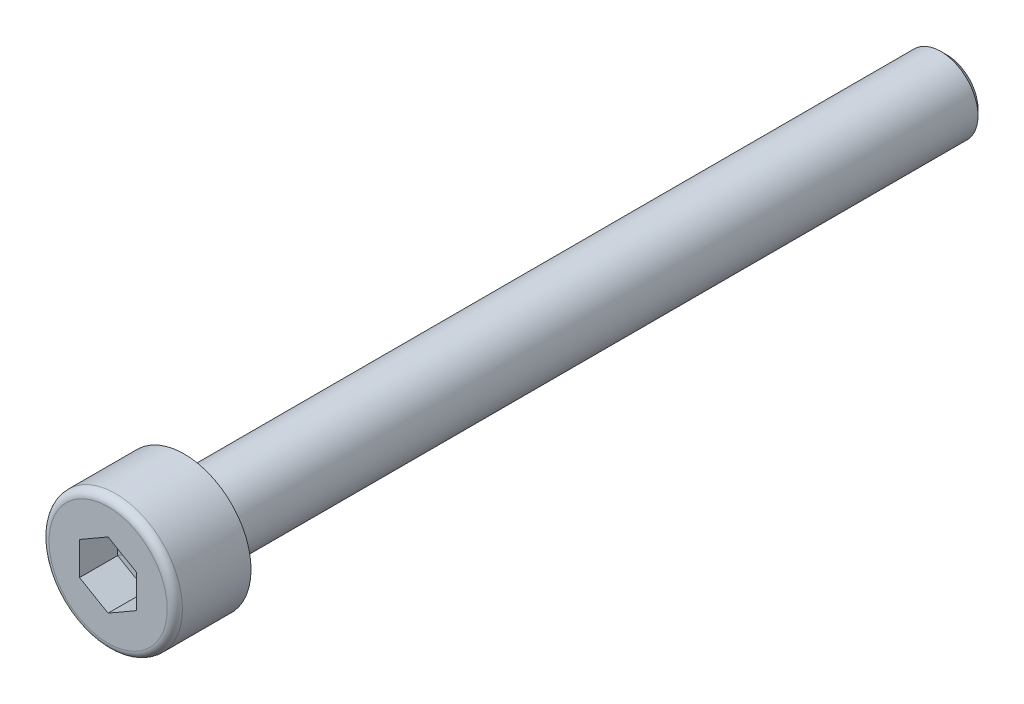
ISO-10303-21;
HEADER;
FILE_DESCRIPTION(('STEP AP214'),'2;1');
FILE_NAME('part.step','',(''),(''),'','','');
FILE_SCHEMA(('AUTOMOTIVE_DESIGN { 1 0 10303 214 1 1 1 1 }'));
ENDSEC;
DATA;
#1=APPLICATION_CONTEXT('core data for automotive mechanical design processes');
#2=APPLICATION_PROTOCOL_DEFINITION('international standard','automotive_design',2000,#1);
#3=PRODUCT_CONTEXT('',#1,'mechanical');
#4=PRODUCT('Part','Part','',(#3));
#5=PRODUCT_RELATED_PRODUCT_CATEGORY('part','',(#4));
#6=PRODUCT_DEFINITION_FORMATION('','',#4);
#7=PRODUCT_DEFINITION_CONTEXT('part definition',#1,'design');
#8=PRODUCT_DEFINITION('design','',#6,#7);
#9=PRODUCT_DEFINITION_SHAPE('','',#8);
#10=(LENGTH_UNIT() NAMED_UNIT(*) SI_UNIT(.MILLI.,.METRE.));
#11=(NAMED_UNIT(*) PLANE_ANGLE_UNIT() SI_UNIT($,.RADIAN.));
#12=(NAMED_UNIT(*) SI_UNIT($,.STERADIAN.) SOLID_ANGLE_UNIT());
#13=UNCERTAINTY_MEASURE_WITH_UNIT(LENGTH_MEASURE(1.E-05),#10,'distance_accuracy_value','');
#14=(GEOMETRIC_REPRESENTATION_CONTEXT(3) GLOBAL_UNCERTAINTY_ASSIGNED_CONTEXT((#13)) GLOBAL_UNIT_ASSIGNED_CONTEXT((#10,
#11,#12)) REPRESENTATION_CONTEXT('',''));
#15=CARTESIAN_POINT('',(0.,0.,0.));
#16=DIRECTION('',(0.,0.,1.));
#17=DIRECTION('',(1.,0.,0.));
#18=AXIS2_PLACEMENT_3D('',#15,#16,#17);
#19=CARTESIAN_POINT('',(-1.99999999999971,0.,-5.5228302982796E-13));
#20=DIRECTION('',(0.,0.,-1.));
#21=DIRECTION('',(0.,-1.,0.));
#22=AXIS2_PLACEMENT_3D('',#19,#20,#21);
#23=PLANE('',#22);
#24=CARTESIAN_POINT('',(0.,0.,-5.46229728115577E-13));
#25=DIRECTION('',(0.,0.,-1.));
#26=DIRECTION('',(-1.,0.,0.));
#27=AXIS2_PLACEMENT_3D('',#24,#25,#26);
#28=CIRCLE('',#27,1.954);
#29=CARTESIAN_POINT('',(1.954,0.,-5.39684409837686E-13));
#30=VERTEX_POINT('',#29);
#31=EDGE_CURVE('E11',#30,#30,#28,.T.);
#32=ORIENTED_EDGE('',*,*,#31,.F.);
#33=EDGE_LOOP('',(#32));
#34=FACE_BOUND('',#33,.T.);
#35=CARTESIAN_POINT('',(0.,0.,-9.56064350066868E-13));
#36=DIRECTION('',(0.,0.,-1.));
#37=DIRECTION('',(1.,0.,0.));
#38=AXIS2_PLACEMENT_3D('',#35,#36,#37);
#39=CIRCLE('',#38,3.49999999999972);
#40=CARTESIAN_POINT('',(3.49999999999971,0.,-9.45354905468321E-13));
#41=VERTEX_POINT('',#40);
#42=EDGE_CURVE('E195',#41,#41,#39,.T.);
#43=ORIENTED_EDGE('',*,*,#42,.T.);
#44=EDGE_LOOP('',(#43));
#45=FACE_BOUND('',#44,.T.);
#46=ADVANCED_FACE('F17',(#34,#45),#23,.T.);
#47=CARTESIAN_POINT('',(1.0769163338864E-13,0.,-40.));
#48=DIRECTION('',(0.,0.,-1.));
#49=DIRECTION('',(0.,-1.,0.));
#50=AXIS2_PLACEMENT_3D('',#47,#48,#49);
#51=PLANE('',#50);
#52=CARTESIAN_POINT('',(0.,0.,-40.));
#53=DIRECTION('',(0.,0.,-1.));
#54=DIRECTION('',(-1.,0.,0.));
#55=AXIS2_PLACEMENT_3D('',#52,#53,#54);
#56=CIRCLE('',#55,1.63999999997624);
#57=CARTESIAN_POINT('',(1.63999999997624,0.,-40.));
#58=VERTEX_POINT('',#57);
#59=EDGE_CURVE('E124',#58,#58,#56,.T.);
#60=ORIENTED_EDGE('',*,*,#59,.T.);
#61=EDGE_LOOP('',(#60));
#62=FACE_BOUND('',#61,.T.);
#63=ADVANCED_FACE('F500',(#62),#51,.T.);
#64=CARTESIAN_POINT('',(0.,0.,-20.0000000000003));
#65=DIRECTION('',(0.,0.,-1.));
#66=DIRECTION('',(-1.,0.,0.));
#67=AXIS2_PLACEMENT_3D('',#64,#65,#66);
#68=CYLINDRICAL_SURFACE('',#67,1.954);
#69=CARTESIAN_POINT('',(1.06776702927888E-13,0.,-39.6859999999766));
#70=DIRECTION('',(0.,0.,1.));
#71=DIRECTION('',(-1.,0.,0.));
#72=AXIS2_PLACEMENT_3D('',#69,#70,#71);
#73=CIRCLE('',#72,1.954);
#74=CARTESIAN_POINT('',(1.95400000000011,0.,-39.6859999999766));
#75=VERTEX_POINT('',#74);
#76=EDGE_CURVE('E117',#75,#75,#73,.T.);
#77=ORIENTED_EDGE('',*,*,#76,.T.);
#78=DIRECTION('',(0.,0.,1.));
#79=VECTOR('',#78,1.);
#80=CARTESIAN_POINT('',(1.95400000000005,0.,-20.0000000000003));
#81=LINE('',#80,#79);
#82=EDGE_CURVE('E20',#75,#30,#81,.T.);
#83=ORIENTED_EDGE('',*,*,#82,.T.);
#84=ORIENTED_EDGE('',*,*,#31,.T.);
#85=ORIENTED_EDGE('',*,*,#82,.F.);
#86=EDGE_LOOP('',(#77,#83,#84,#85));
#87=FACE_BOUND('',#86,.T.);
#88=ADVANCED_FACE('F115',(#87),#68,.T.);
#89=CARTESIAN_POINT('',(-1.5,0.866025403784454,4.));
#90=DIRECTION('',(-0.5,0.866025403784438,0.));
#91=DIRECTION('',(0.,0.,1.));
#92=AXIS2_PLACEMENT_3D('',#89,#90,#91);
#93=PLANE('',#92);
#94=DIRECTION('',(0.866025403784438,0.5,0.));
#95=VECTOR('',#94,1.);
#96=CARTESIAN_POINT('',(-2.4374999999999,0.324759526419233,3.99999999999474));
#97=LINE('',#96,#95);
#98=CARTESIAN_POINT('',(-1.5,0.866025403784454,4.));
#99=VERTEX_POINT('',#98);
#100=CARTESIAN_POINT('',(0.,1.73205080756889,4.));
#101=VERTEX_POINT('',#100);
#102=EDGE_CURVE('E137',#99,#101,#97,.T.);
#103=ORIENTED_EDGE('',*,*,#102,.F.);
#104=DIRECTION('',(0.,0.,-1.));
#105=VECTOR('',#104,1.);
#106=CARTESIAN_POINT('',(-1.5,0.866025403784454,4.));
#107=LINE('',#106,#105);
#108=CARTESIAN_POINT('',(-1.5,0.866025403784454,2.));
#109=VERTEX_POINT('',#108);
#110=EDGE_CURVE('E139',#99,#109,#107,.T.);
#111=ORIENTED_EDGE('',*,*,#110,.T.);
#112=DIRECTION('',(0.866025403784438,0.5,0.));
#113=VECTOR('',#112,1.);
#114=CARTESIAN_POINT('',(0.,1.73205080756889,2.));
#115=LINE('',#114,#113);
#116=CARTESIAN_POINT('',(0.,1.73205080756889,2.));
#117=VERTEX_POINT('',#116);
#118=EDGE_CURVE('E219',#109,#117,#115,.T.);
#119=ORIENTED_EDGE('',*,*,#118,.T.);
#120=DIRECTION('',(0.,0.,-1.));
#121=VECTOR('',#120,1.);
#122=CARTESIAN_POINT('',(0.,1.73205080756889,4.));
#123=LINE('',#122,#121);
#124=EDGE_CURVE('E45',#101,#117,#123,.T.);
#125=ORIENTED_EDGE('',*,*,#124,.F.);
#126=EDGE_LOOP('',(#103,#111,#119,#125));
#127=FACE_BOUND('',#126,.T.);
#128=ADVANCED_FACE('F483',(#127),#93,.F.);
#129=CARTESIAN_POINT('',(0.,1.73205080756889,4.));
#130=DIRECTION('',(0.5,0.866025403784438,0.));
#131=DIRECTION('',(0.,0.,-1.));
#132=AXIS2_PLACEMENT_3D('',#129,#130,#131);
#133=PLANE('',#132);
#134=DIRECTION('',(0.866025403784438,-0.5,0.));
#135=VECTOR('',#134,1.);
#136=CARTESIAN_POINT('',(-0.937499999999895,2.27331668493411,3.99999999999474));
#137=LINE('',#136,#135);
#138=CARTESIAN_POINT('',(1.5,0.866025403784452,4.));
#139=VERTEX_POINT('',#138);
#140=EDGE_CURVE('E173',#101,#139,#137,.T.);
#141=ORIENTED_EDGE('',*,*,#140,.F.);
#142=ORIENTED_EDGE('',*,*,#124,.T.);
#143=DIRECTION('',(0.866025403784438,-0.5,0.));
#144=VECTOR('',#143,1.);
#145=CARTESIAN_POINT('',(1.5,0.866025403784452,2.));
#146=LINE('',#145,#144);
#147=CARTESIAN_POINT('',(1.5,0.866025403784452,2.));
#148=VERTEX_POINT('',#147);
#149=EDGE_CURVE('E215',#117,#148,#146,.T.);
#150=ORIENTED_EDGE('',*,*,#149,.T.);
#151=DIRECTION('',(0.,0.,-1.));
#152=VECTOR('',#151,1.);
#153=CARTESIAN_POINT('',(1.5,0.866025403784452,4.));
#154=LINE('',#153,#152);
#155=EDGE_CURVE('E229',#139,#148,#154,.T.);
#156=ORIENTED_EDGE('',*,*,#155,.F.);
#157=EDGE_LOOP('',(#141,#142,#150,#156));
#158=FACE_BOUND('',#157,.T.);
#159=ADVANCED_FACE('F474',(#158),#133,.F.);
#160=CARTESIAN_POINT('',(1.5,0.866025403784452,4.));
#161=DIRECTION('',(1.,0.,0.));
#162=DIRECTION('',(0.,-1.,0.));
#163=AXIS2_PLACEMENT_3D('',#160,#161,#162);
#164=PLANE('',#163);
#165=DIRECTION('',(0.,-1.,0.));
#166=VECTOR('',#165,1.);
#167=CARTESIAN_POINT('',(1.5,0.433012701892219,3.99999999999475));
#168=LINE('',#167,#166);
#169=CARTESIAN_POINT('',(1.5,-0.866025403784423,4.));
#170=VERTEX_POINT('',#169);
#171=EDGE_CURVE('E177',#139,#170,#168,.T.);
#172=ORIENTED_EDGE('',*,*,#171,.F.);
#173=ORIENTED_EDGE('',*,*,#155,.T.);
#174=DIRECTION('',(0.,-1.,0.));
#175=VECTOR('',#174,1.);
#176=CARTESIAN_POINT('',(1.5,-0.866025403784423,2.));
#177=LINE('',#176,#175);
#178=CARTESIAN_POINT('',(1.5,-0.866025403784423,2.));
#179=VERTEX_POINT('',#178);
#180=EDGE_CURVE('E182',#148,#179,#177,.T.);
#181=ORIENTED_EDGE('',*,*,#180,.T.);
#182=DIRECTION('',(0.,0.,-1.));
#183=VECTOR('',#182,1.);
#184=CARTESIAN_POINT('',(1.5,-0.866025403784423,4.));
#185=LINE('',#184,#183);
#186=EDGE_CURVE('E226',#170,#179,#185,.T.);
#187=ORIENTED_EDGE('',*,*,#186,.F.);
#188=EDGE_LOOP('',(#172,#173,#181,#187));
#189=FACE_BOUND('',#188,.T.);
#190=ADVANCED_FACE('F465',(#189),#164,.F.);
#191=CARTESIAN_POINT('',(1.5,-0.866025403784423,4.));
#192=DIRECTION('',(0.5,-0.866025403784438,0.));
#193=DIRECTION('',(0.,0.,-1.));
#194=AXIS2_PLACEMENT_3D('',#191,#192,#193);
#195=PLANE('',#194);
#196=DIRECTION('',(-0.866025403784438,-0.5,0.));
#197=VECTOR('',#196,1.);
#198=CARTESIAN_POINT('',(-0.187499999999902,-1.84030398304186,3.99999999999475));
#199=LINE('',#198,#197);
#200=CARTESIAN_POINT('',(0.,-1.73205080756886,4.));
#201=VERTEX_POINT('',#200);
#202=EDGE_CURVE('E190',#170,#201,#199,.T.);
#203=ORIENTED_EDGE('',*,*,#202,.F.);
#204=ORIENTED_EDGE('',*,*,#186,.T.);
#205=DIRECTION('',(-0.866025403784438,-0.5,0.));
#206=VECTOR('',#205,1.);
#207=CARTESIAN_POINT('',(0.,-1.73205080756886,2.));
#208=LINE('',#207,#206);
#209=CARTESIAN_POINT('',(0.,-1.73205080756886,2.));
#210=VERTEX_POINT('',#209);
#211=EDGE_CURVE('E154',#179,#210,#208,.T.);
#212=ORIENTED_EDGE('',*,*,#211,.T.);
#213=DIRECTION('',(0.,0.,-1.));
#214=VECTOR('',#213,1.);
#215=CARTESIAN_POINT('',(0.,-1.73205080756886,4.));
#216=LINE('',#215,#214);
#217=EDGE_CURVE('E142',#201,#210,#216,.T.);
#218=ORIENTED_EDGE('',*,*,#217,.F.);
#219=EDGE_LOOP('',(#203,#204,#212,#218));
#220=FACE_BOUND('',#219,.T.);
#221=ADVANCED_FACE('F455',(#220),#195,.F.);
#222=CARTESIAN_POINT('',(0.,-1.73205080756886,4.));
#223=DIRECTION('',(-0.5,-0.866025403784438,0.));
#224=DIRECTION('',(-0.866025403784438,0.5,0.));
#225=AXIS2_PLACEMENT_3D('',#222,#223,#224);
#226=PLANE('',#225);
#227=DIRECTION('',(-0.866025403784438,0.5,0.));
#228=VECTOR('',#227,1.);
#229=CARTESIAN_POINT('',(-1.6874999999999,-0.757772228311425,3.99999999999474));
#230=LINE('',#229,#228);
#231=CARTESIAN_POINT('',(-1.5,-0.866025403784421,4.));
#232=VERTEX_POINT('',#231);
#233=EDGE_CURVE('E191',#201,#232,#230,.T.);
#234=ORIENTED_EDGE('',*,*,#233,.F.);
#235=ORIENTED_EDGE('',*,*,#217,.T.);
#236=DIRECTION('',(-0.866025403784438,0.5,0.));
#237=VECTOR('',#236,1.);
#238=CARTESIAN_POINT('',(-1.5,-0.866025403784421,2.));
#239=LINE('',#238,#237);
#240=CARTESIAN_POINT('',(-1.5,-0.866025403784421,2.));
#241=VERTEX_POINT('',#240);
#242=EDGE_CURVE('E155',#210,#241,#239,.T.);
#243=ORIENTED_EDGE('',*,*,#242,.T.);
#244=DIRECTION('',(0.,0.,-1.));
#245=VECTOR('',#244,1.);
#246=CARTESIAN_POINT('',(-1.5,-0.866025403784421,4.));
#247=LINE('',#246,#245);
#248=EDGE_CURVE('E143',#232,#241,#247,.T.);
#249=ORIENTED_EDGE('',*,*,#248,.F.);
#250=EDGE_LOOP('',(#234,#235,#243,#249));
#251=FACE_BOUND('',#250,.T.);
#252=ADVANCED_FACE('F446',(#251),#226,.F.);
#253=CARTESIAN_POINT('',(-1.5,-0.866025403784421,4.));
#254=DIRECTION('',(-1.,0.,0.));
#255=DIRECTION('',(0.,0.,1.));
#256=AXIS2_PLACEMENT_3D('',#253,#254,#255);
#257=PLANE('',#256);
#258=DIRECTION('',(0.,1.,0.));
#259=VECTOR('',#258,1.);
#260=CARTESIAN_POINT('',(-1.5,-0.43301270189221,3.99999999999474));
#261=LINE('',#260,#259);
#262=EDGE_CURVE('E156',#232,#99,#261,.T.);
#263=ORIENTED_EDGE('',*,*,#262,.F.);
#264=ORIENTED_EDGE('',*,*,#248,.T.);
#265=DIRECTION('',(0.,1.,0.));
#266=VECTOR('',#265,1.);
#267=CARTESIAN_POINT('',(-1.5,0.866025403784454,2.));
#268=LINE('',#267,#266);
#269=EDGE_CURVE('E144',#241,#109,#268,.T.);
#270=ORIENTED_EDGE('',*,*,#269,.T.);
#271=ORIENTED_EDGE('',*,*,#110,.F.);
#272=EDGE_LOOP('',(#263,#264,#270,#271));
#273=FACE_BOUND('',#272,.T.);
#274=ADVANCED_FACE('F435',(#273),#257,.F.);
#275=CARTESIAN_POINT('',(0.,1.73205080756889,2.));
#276=DIRECTION('',(-0.0435778713738291,0.0754790873051732,-0.996194698091746));
#277=DIRECTION('',(-0.999044587684655,0.,0.0437025378896691));
#278=AXIS2_PLACEMENT_3D('',#275,#276,#277);
#279=PLANE('',#278);
#280=DIRECTION('',(0.,-0.997141949694317,-0.0755508581011306));
#281=VECTOR('',#280,1.);
#282=CARTESIAN_POINT('',(0.,1.30150971280341,1.96737901843634));
#283=LINE('',#282,#281);
#284=CARTESIAN_POINT('',(0.,0.,1.86876700471111));
#285=VERTEX_POINT('',#284);
#286=EDGE_CURVE('E216',#117,#285,#283,.T.);
#287=ORIENTED_EDGE('',*,*,#286,.F.);
#288=ORIENTED_EDGE('',*,*,#118,.F.);
#289=DIRECTION('',(0.863550259614423,-0.498570974847158,-0.0755508581011305));
#290=VECTOR('',#289,1.);
#291=CARTESIAN_POINT('',(-1.12714047455993,0.650754856401714,1.96737901843634));
#292=LINE('',#291,#290);
#293=EDGE_CURVE('E149',#109,#285,#292,.T.);
#294=ORIENTED_EDGE('',*,*,#293,.T.);
#295=EDGE_LOOP('',(#287,#288,#294));
#296=FACE_BOUND('',#295,.T.);
#297=ADVANCED_FACE('F425',(#296),#279,.F.);
#298=CARTESIAN_POINT('',(1.5,0.866025403784452,2.));
#299=DIRECTION('',(0.0435778713738292,0.0754790873051732,-0.996194698091746));
#300=DIRECTION('',(-0.999044587684655,0.,-0.0437025378896692));
#301=AXIS2_PLACEMENT_3D('',#298,#299,#300);
#302=PLANE('',#301);
#303=DIRECTION('',(-0.863550259614424,-0.498570974847157,-0.0755508581011305));
#304=VECTOR('',#303,1.);
#305=CARTESIAN_POINT('',(1.12714047455993,0.650754856401714,1.96737901843634));
#306=LINE('',#305,#304);
#307=EDGE_CURVE('E211',#148,#285,#306,.T.);
#308=ORIENTED_EDGE('',*,*,#307,.F.);
#309=ORIENTED_EDGE('',*,*,#149,.F.);
#310=ORIENTED_EDGE('',*,*,#286,.T.);
#311=EDGE_LOOP('',(#308,#309,#310));
#312=FACE_BOUND('',#311,.T.);
#313=ADVANCED_FACE('F415',(#312),#302,.F.);
#314=CARTESIAN_POINT('',(1.5,-0.866025403784423,2.));
#315=DIRECTION('',(0.0871557427476581,0.,-0.996194698091746));
#316=DIRECTION('',(0.,-1.,0.));
#317=AXIS2_PLACEMENT_3D('',#314,#315,#316);
#318=PLANE('',#317);
#319=DIRECTION('',(-0.863550259614423,0.498570974847159,-0.0755508581011306));
#320=VECTOR('',#319,1.);
#321=CARTESIAN_POINT('',(1.12714047455993,-0.650754856401685,1.96737901843634));
#322=LINE('',#321,#320);
#323=EDGE_CURVE('E178',#179,#285,#322,.T.);
#324=ORIENTED_EDGE('',*,*,#323,.F.);
#325=ORIENTED_EDGE('',*,*,#180,.F.);
#326=ORIENTED_EDGE('',*,*,#307,.T.);
#327=EDGE_LOOP('',(#324,#325,#326));
#328=FACE_BOUND('',#327,.T.);
#329=ADVANCED_FACE('F405',(#328),#318,.F.);
#330=CARTESIAN_POINT('',(0.,-1.73205080756886,2.));
#331=DIRECTION('',(0.0435778713738292,-0.0754790873051732,-0.996194698091746));
#332=DIRECTION('',(0.,-0.997141949694317,0.0755508581011304));
#333=AXIS2_PLACEMENT_3D('',#330,#331,#332);
#334=PLANE('',#333);
#335=DIRECTION('',(0.,0.997141949694317,-0.0755508581011304));
#336=VECTOR('',#335,1.);
#337=CARTESIAN_POINT('',(0.,-1.30150971280338,1.96737901843634));
#338=LINE('',#337,#336);
#339=EDGE_CURVE('E150',#210,#285,#338,.T.);
#340=ORIENTED_EDGE('',*,*,#339,.F.);
#341=ORIENTED_EDGE('',*,*,#211,.F.);
#342=ORIENTED_EDGE('',*,*,#323,.T.);
#343=EDGE_LOOP('',(#340,#341,#342));
#344=FACE_BOUND('',#343,.T.);
#345=ADVANCED_FACE('F395',(#344),#334,.F.);
#346=CARTESIAN_POINT('',(-1.5,-0.866025403784421,2.));
#347=DIRECTION('',(-0.0435778713738292,-0.0754790873051732,-0.996194698091746));
#348=DIRECTION('',(0.,-0.997141949694317,0.0755508581011304));
#349=AXIS2_PLACEMENT_3D('',#346,#347,#348);
#350=PLANE('',#349);
#351=DIRECTION('',(0.863550259614423,0.498570974847157,-0.0755508581011306));
#352=VECTOR('',#351,1.);
#353=CARTESIAN_POINT('',(-1.12714047455993,-0.650754856401681,1.96737901843634));
#354=LINE('',#353,#352);
#355=EDGE_CURVE('E148',#241,#285,#354,.T.);
#356=ORIENTED_EDGE('',*,*,#355,.F.);
#357=ORIENTED_EDGE('',*,*,#242,.F.);
#358=ORIENTED_EDGE('',*,*,#339,.T.);
#359=EDGE_LOOP('',(#356,#357,#358));
#360=FACE_BOUND('',#359,.T.);
#361=ADVANCED_FACE('F385',(#360),#350,.F.);
#362=CARTESIAN_POINT('',(-1.5,0.866025403784454,2.));
#363=DIRECTION('',(-0.0871557427476581,0.,-0.996194698091746));
#364=DIRECTION('',(-0.996194698091746,0.,0.0871557427476581));
#365=AXIS2_PLACEMENT_3D('',#362,#363,#364);
#366=PLANE('',#365);
#367=ORIENTED_EDGE('',*,*,#293,.F.);
#368=ORIENTED_EDGE('',*,*,#269,.F.);
#369=ORIENTED_EDGE('',*,*,#355,.T.);
#370=EDGE_LOOP('',(#367,#368,#369));
#371=FACE_BOUND('',#370,.T.);
#372=ADVANCED_FACE('F374',(#371),#366,.F.);
#373=CARTESIAN_POINT('',(0.,0.,1.9999999999969));
#374=DIRECTION('',(0.,0.,-1.));
#375=DIRECTION('',(-1.,0.,0.));
#376=AXIS2_PLACEMENT_3D('',#373,#374,#375);
#377=CYLINDRICAL_SURFACE('',#376,3.49999999999972);
#378=ORIENTED_EDGE('',*,*,#42,.F.);
#379=DIRECTION('',(0.,0.,1.));
#380=VECTOR('',#379,1.);
#381=CARTESIAN_POINT('',(3.4999999999997,0.,1.99999999999691));
#382=LINE('',#381,#380);
#383=CARTESIAN_POINT('',(3.49999999999969,0.,3.59999999999476));
#384=VERTEX_POINT('',#383);
#385=EDGE_CURVE('E186',#41,#384,#382,.T.);
#386=ORIENTED_EDGE('',*,*,#385,.T.);
#387=CARTESIAN_POINT('',(0.,0.,3.59999999999475));
#388=DIRECTION('',(0.,0.,1.));
#389=DIRECTION('',(1.,0.,0.));
#390=AXIS2_PLACEMENT_3D('',#387,#388,#389);
#391=CIRCLE('',#390,3.49999999999972);
#392=EDGE_CURVE('E132',#384,#384,#391,.T.);
#393=ORIENTED_EDGE('',*,*,#392,.F.);
#394=ORIENTED_EDGE('',*,*,#385,.F.);
#395=EDGE_LOOP('',(#378,#386,#393,#394));
#396=FACE_BOUND('',#395,.T.);
#397=ADVANCED_FACE('F363',(#396),#377,.T.);
#398=CARTESIAN_POINT('',(-3.49999999999974,0.,3.99999999999474));
#399=DIRECTION('',(0.,0.,1.));
#400=DIRECTION('',(1.,0.,0.));
#401=AXIS2_PLACEMENT_3D('',#398,#399,#400);
#402=PLANE('',#401);
#403=ORIENTED_EDGE('',*,*,#262,.T.);
#404=ORIENTED_EDGE('',*,*,#102,.T.);
#405=ORIENTED_EDGE('',*,*,#140,.T.);
#406=ORIENTED_EDGE('',*,*,#171,.T.);
#407=ORIENTED_EDGE('',*,*,#202,.T.);
#408=ORIENTED_EDGE('',*,*,#233,.T.);
#409=EDGE_LOOP('',(#403,#404,#405,#406,#407,#408));
#410=FACE_BOUND('',#409,.T.);
#411=CARTESIAN_POINT('',(0.,0.,3.99999999999475));
#412=DIRECTION('',(0.,0.,-1.));
#413=DIRECTION('',(1.,0.,0.));
#414=AXIS2_PLACEMENT_3D('',#411,#412,#413);
#415=CIRCLE('',#414,3.09999999999972);
#416=CARTESIAN_POINT('',(3.09999999999969,0.,3.99999999999476));
#417=VERTEX_POINT('',#416);
#418=EDGE_CURVE('E159',#417,#417,#415,.T.);
#419=ORIENTED_EDGE('',*,*,#418,.F.);
#420=EDGE_LOOP('',(#419));
#421=FACE_BOUND('',#420,.T.);
#422=ADVANCED_FACE('F353',(#410,#421),#402,.T.);
#423=CARTESIAN_POINT('',(0.,0.,3.59999999999475));
#424=DIRECTION('',(0.,0.,-1.));
#425=DIRECTION('',(-1.,0.,0.));
#426=AXIS2_PLACEMENT_3D('',#423,#424,#425);
#427=TOROIDAL_SURFACE('',#426,3.09999999999972,0.4);
#428=ORIENTED_EDGE('',*,*,#392,.T.);
#429=CARTESIAN_POINT('',(3.09999999999969,0.,3.59999999999476));
#430=DIRECTION('',(0.,-1.,0.));
#431=DIRECTION('',(1.,0.,0.));
#432=AXIS2_PLACEMENT_3D('',#429,#430,#431);
#433=CIRCLE('',#432,0.4);
#434=EDGE_CURVE('E167',#384,#417,#433,.T.);
#435=ORIENTED_EDGE('',*,*,#434,.T.);
#436=ORIENTED_EDGE('',*,*,#418,.T.);
#437=ORIENTED_EDGE('',*,*,#434,.F.);
#438=EDGE_LOOP('',(#428,#435,#436,#437));
#439=FACE_BOUND('',#438,.T.);
#440=ADVANCED_FACE('F342',(#439),#427,.T.);
#441=CARTESIAN_POINT('',(0.,0.,-39.8));
#442=DIRECTION('',(0.,0.,1.));
#443=DIRECTION('',(-1.,0.,0.));
#444=AXIS2_PLACEMENT_3D('',#441,#442,#443);
#445=CONICAL_SURFACE('',#444,1.83999999997644,0.785398163397953);
#446=ORIENTED_EDGE('',*,*,#76,.F.);
#447=DIRECTION('',(-0.707106781186905,0.,-0.70710678118619));
#448=VECTOR('',#447,1.);
#449=CARTESIAN_POINT('',(1.83999999997644,0.,-39.8));
#450=LINE('',#449,#448);
#451=EDGE_CURVE('E122',#75,#58,#450,.T.);
#452=ORIENTED_EDGE('',*,*,#451,.T.);
#453=ORIENTED_EDGE('',*,*,#59,.F.);
#454=ORIENTED_EDGE('',*,*,#451,.F.);
#455=EDGE_LOOP('',(#446,#452,#453,#454));
#456=FACE_BOUND('',#455,.T.);
#457=ADVANCED_FACE('F123',(#456),#445,.T.);
#458=CLOSED_SHELL('',(#46,#63,#88,#128,#159,#190,#221,#252,#274,#297,#313,#329,#345,#361,#372,
#397,#422,#440,#457));
#459=MANIFOLD_SOLID_BREP('B1',#458);
#460=ADVANCED_BREP_SHAPE_REPRESENTATION('',(#18,#459),#14);
#461=SHAPE_DEFINITION_REPRESENTATION(#9,#460);
ENDSEC;
END-ISO-10303-21;
